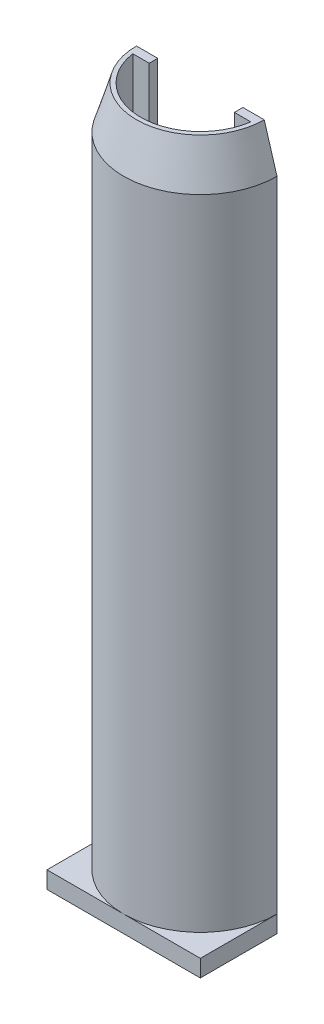
ISO-10303-21;
HEADER;
FILE_DESCRIPTION(('STEP AP214'),'2;1');
FILE_NAME('part.step','',(''),(''),'','','');
FILE_SCHEMA(('AUTOMOTIVE_DESIGN { 1 0 10303 214 1 1 1 1 }'));
ENDSEC;
DATA;
#1=APPLICATION_CONTEXT('core data for automotive mechanical design processes');
#2=APPLICATION_PROTOCOL_DEFINITION('international standard','automotive_design',2000,#1);
#3=PRODUCT_CONTEXT('',#1,'mechanical');
#4=PRODUCT('Part','Part','',(#3));
#5=PRODUCT_RELATED_PRODUCT_CATEGORY('part','',(#4));
#6=PRODUCT_DEFINITION_FORMATION('','',#4);
#7=PRODUCT_DEFINITION_CONTEXT('part definition',#1,'design');
#8=PRODUCT_DEFINITION('design','',#6,#7);
#9=PRODUCT_DEFINITION_SHAPE('','',#8);
#10=(LENGTH_UNIT() NAMED_UNIT(*) SI_UNIT(.MILLI.,.METRE.));
#11=(NAMED_UNIT(*) PLANE_ANGLE_UNIT() SI_UNIT($,.RADIAN.));
#12=(NAMED_UNIT(*) SI_UNIT($,.STERADIAN.) SOLID_ANGLE_UNIT());
#13=UNCERTAINTY_MEASURE_WITH_UNIT(LENGTH_MEASURE(1.E-05),#10,'distance_accuracy_value','');
#14=(GEOMETRIC_REPRESENTATION_CONTEXT(3) GLOBAL_UNCERTAINTY_ASSIGNED_CONTEXT((#13)) GLOBAL_UNIT_ASSIGNED_CONTEXT((#10,
#11,#12)) REPRESENTATION_CONTEXT('',''));
#15=CARTESIAN_POINT('',(0.,0.,0.));
#16=DIRECTION('',(0.,0.,1.));
#17=DIRECTION('',(1.,0.,0.));
#18=AXIS2_PLACEMENT_3D('',#15,#16,#17);
#19=CARTESIAN_POINT('',(6.01639961538458,-38.3571695384616,0.));
#20=DIRECTION('',(-1.,0.,0.));
#21=DIRECTION('',(0.,0.,1.));
#22=AXIS2_PLACEMENT_3D('',#19,#20,#21);
#23=PLANE('',#22);
#24=DIRECTION('',(0.,0.,1.));
#25=VECTOR('',#24,1.);
#26=CARTESIAN_POINT('',(6.01639961538458,-36.3571695384616,0.));
#27=LINE('',#26,#25);
#28=CARTESIAN_POINT('',(6.01639961538459,-36.3571695384616,0.));
#29=VERTEX_POINT('',#28);
#30=CARTESIAN_POINT('',(6.01639961538459,-36.3571695384616,9.));
#31=VERTEX_POINT('',#30);
#32=EDGE_CURVE('E135',#29,#31,#27,.T.);
#33=ORIENTED_EDGE('',*,*,#32,.F.);
#34=DIRECTION('',(0.,1.,0.));
#35=VECTOR('',#34,1.);
#36=CARTESIAN_POINT('',(6.01639961538459,-38.3571695384616,0.));
#37=LINE('',#36,#35);
#38=CARTESIAN_POINT('',(6.01639961538459,-38.3571695384616,0.));
#39=VERTEX_POINT('',#38);
#40=EDGE_CURVE('E13',#39,#29,#37,.T.);
#41=ORIENTED_EDGE('',*,*,#40,.F.);
#42=DIRECTION('',(0.,0.,1.));
#43=VECTOR('',#42,1.);
#44=CARTESIAN_POINT('',(6.01639961538458,-38.3571695384616,0.));
#45=LINE('',#44,#43);
#46=CARTESIAN_POINT('',(6.01639961538459,-38.3571695384616,9.));
#47=VERTEX_POINT('',#46);
#48=EDGE_CURVE('E148',#39,#47,#45,.T.);
#49=ORIENTED_EDGE('',*,*,#48,.T.);
#50=DIRECTION('',(0.,1.,0.));
#51=VECTOR('',#50,1.);
#52=CARTESIAN_POINT('',(6.01639961538459,-38.3571695384616,9.));
#53=LINE('',#52,#51);
#54=EDGE_CURVE('E100',#47,#31,#53,.T.);
#55=ORIENTED_EDGE('',*,*,#54,.T.);
#56=EDGE_LOOP('',(#33,#41,#49,#55));
#57=FACE_BOUND('',#56,.T.);
#58=ADVANCED_FACE('F55',(#57),#23,.T.);
#59=CARTESIAN_POINT('',(0.,-38.3571695384616,-1.04858958067453E-13));
#60=DIRECTION('',(0.,0.,1.));
#61=DIRECTION('',(1.,0.,0.));
#62=AXIS2_PLACEMENT_3D('',#59,#60,#61);
#63=PLANE('',#62);
#64=DIRECTION('',(1.,0.,0.));
#65=VECTOR('',#64,1.);
#66=CARTESIAN_POINT('',(0.,-36.3571695384616,-1.04858958067453E-13));
#67=LINE('',#66,#65);
#68=CARTESIAN_POINT('',(8.01639961538459,-36.3571695384616,0.));
#69=VERTEX_POINT('',#68);
#70=EDGE_CURVE('E138',#29,#69,#67,.T.);
#71=ORIENTED_EDGE('',*,*,#70,.T.);
#72=DIRECTION('',(0.,1.,0.));
#73=VECTOR('',#72,1.);
#74=CARTESIAN_POINT('',(8.01639961538459,-38.3571695384616,0.));
#75=LINE('',#74,#73);
#76=CARTESIAN_POINT('',(8.01639961538459,-38.3571695384616,0.));
#77=VERTEX_POINT('',#76);
#78=EDGE_CURVE('E63',#77,#69,#75,.T.);
#79=ORIENTED_EDGE('',*,*,#78,.F.);
#80=DIRECTION('',(1.,0.,0.));
#81=VECTOR('',#80,1.);
#82=CARTESIAN_POINT('',(0.,-38.3571695384616,-1.04858958067453E-13));
#83=LINE('',#82,#81);
#84=EDGE_CURVE('E163',#39,#77,#83,.T.);
#85=ORIENTED_EDGE('',*,*,#84,.F.);
#86=ORIENTED_EDGE('',*,*,#40,.T.);
#87=EDGE_LOOP('',(#71,#79,#85,#86));
#88=FACE_BOUND('',#87,.T.);
#89=ADVANCED_FACE('F157',(#88),#63,.F.);
#90=CARTESIAN_POINT('',(15.0163996153846,-38.3571695384616,0.));
#91=DIRECTION('',(0.,1.,0.));
#92=DIRECTION('',(-1.,0.,0.));
#93=AXIS2_PLACEMENT_3D('',#90,#91,#92);
#94=CYLINDRICAL_SURFACE('',#93,7.);
#95=CARTESIAN_POINT('',(15.0163996153846,-36.3571695384616,0.));
#96=DIRECTION('',(0.,-1.,0.));
#97=DIRECTION('',(0.,0.,-1.));
#98=AXIS2_PLACEMENT_3D('',#95,#96,#97);
#99=CIRCLE('',#98,7.);
#100=CARTESIAN_POINT('',(22.0163996153846,-36.3571695384616,0.));
#101=VERTEX_POINT('',#100);
#102=EDGE_CURVE('E141',#101,#69,#99,.T.);
#103=ORIENTED_EDGE('',*,*,#102,.F.);
#104=DIRECTION('',(0.,1.,0.));
#105=VECTOR('',#104,1.);
#106=CARTESIAN_POINT('',(22.0163996153846,-38.3571695384616,0.));
#107=LINE('',#106,#105);
#108=CARTESIAN_POINT('',(22.0163996153846,-38.3571695384616,0.));
#109=VERTEX_POINT('',#108);
#110=EDGE_CURVE('E127',#109,#101,#107,.T.);
#111=ORIENTED_EDGE('',*,*,#110,.F.);
#112=CARTESIAN_POINT('',(15.0163996153846,-38.3571695384616,0.));
#113=DIRECTION('',(0.,-1.,0.));
#114=DIRECTION('',(0.,0.,-1.));
#115=AXIS2_PLACEMENT_3D('',#112,#113,#114);
#116=CIRCLE('',#115,7.);
#117=EDGE_CURVE('E120',#109,#77,#116,.T.);
#118=ORIENTED_EDGE('',*,*,#117,.T.);
#119=ORIENTED_EDGE('',*,*,#78,.T.);
#120=EDGE_LOOP('',(#103,#111,#118,#119));
#121=FACE_BOUND('',#120,.T.);
#122=ADVANCED_FACE('F154',(#121),#94,.F.);
#123=CARTESIAN_POINT('',(0.,-38.3571695384616,0.));
#124=DIRECTION('',(0.,0.,1.));
#125=DIRECTION('',(1.,0.,0.));
#126=AXIS2_PLACEMENT_3D('',#123,#124,#125);
#127=PLANE('',#126);
#128=DIRECTION('',(1.,0.,0.));
#129=VECTOR('',#128,1.);
#130=CARTESIAN_POINT('',(0.,-36.3571695384616,0.));
#131=LINE('',#130,#129);
#132=CARTESIAN_POINT('',(24.0163996153846,-36.3571695384616,0.));
#133=VERTEX_POINT('',#132);
#134=EDGE_CURVE('E126',#101,#133,#131,.T.);
#135=ORIENTED_EDGE('',*,*,#134,.T.);
#136=DIRECTION('',(0.,1.,0.));
#137=VECTOR('',#136,1.);
#138=CARTESIAN_POINT('',(24.0163996153846,-38.3571695384616,0.));
#139=LINE('',#138,#137);
#140=CARTESIAN_POINT('',(24.0163996153846,-38.3571695384616,0.));
#141=VERTEX_POINT('',#140);
#142=EDGE_CURVE('E123',#141,#133,#139,.T.);
#143=ORIENTED_EDGE('',*,*,#142,.F.);
#144=DIRECTION('',(1.,0.,0.));
#145=VECTOR('',#144,1.);
#146=CARTESIAN_POINT('',(0.,-38.3571695384616,0.));
#147=LINE('',#146,#145);
#148=EDGE_CURVE('E114',#109,#141,#147,.T.);
#149=ORIENTED_EDGE('',*,*,#148,.F.);
#150=ORIENTED_EDGE('',*,*,#110,.T.);
#151=EDGE_LOOP('',(#135,#143,#149,#150));
#152=FACE_BOUND('',#151,.T.);
#153=ADVANCED_FACE('F124',(#152),#127,.F.);
#154=CARTESIAN_POINT('',(24.0163996153846,-38.3571695384616,0.));
#155=DIRECTION('',(-1.,0.,0.));
#156=DIRECTION('',(0.,0.,1.));
#157=AXIS2_PLACEMENT_3D('',#154,#155,#156);
#158=PLANE('',#157);
#159=DIRECTION('',(0.,0.,1.));
#160=VECTOR('',#159,1.);
#161=CARTESIAN_POINT('',(24.0163996153846,-36.3571695384616,0.));
#162=LINE('',#161,#160);
#163=CARTESIAN_POINT('',(24.0163996153846,-36.3571695384616,9.));
#164=VERTEX_POINT('',#163);
#165=EDGE_CURVE('E93',#133,#164,#162,.T.);
#166=ORIENTED_EDGE('',*,*,#165,.T.);
#167=DIRECTION('',(0.,1.,0.));
#168=VECTOR('',#167,1.);
#169=CARTESIAN_POINT('',(24.0163996153846,-38.3571695384616,9.));
#170=LINE('',#169,#168);
#171=CARTESIAN_POINT('',(24.0163996153846,-38.3571695384616,9.));
#172=VERTEX_POINT('',#171);
#173=EDGE_CURVE('E128',#172,#164,#170,.T.);
#174=ORIENTED_EDGE('',*,*,#173,.F.);
#175=DIRECTION('',(0.,0.,1.));
#176=VECTOR('',#175,1.);
#177=CARTESIAN_POINT('',(24.0163996153846,-38.3571695384616,0.));
#178=LINE('',#177,#176);
#179=EDGE_CURVE('E118',#141,#172,#178,.T.);
#180=ORIENTED_EDGE('',*,*,#179,.F.);
#181=ORIENTED_EDGE('',*,*,#142,.T.);
#182=EDGE_LOOP('',(#166,#174,#180,#181));
#183=FACE_BOUND('',#182,.T.);
#184=ADVANCED_FACE('F130',(#183),#158,.F.);
#185=CARTESIAN_POINT('',(0.,-38.3571695384616,9.));
#186=DIRECTION('',(0.,0.,-1.));
#187=DIRECTION('',(-1.,0.,0.));
#188=AXIS2_PLACEMENT_3D('',#185,#186,#187);
#189=PLANE('',#188);
#190=DIRECTION('',(-1.,0.,0.));
#191=VECTOR('',#190,1.);
#192=CARTESIAN_POINT('',(0.,-36.3571695384616,9.));
#193=LINE('',#192,#191);
#194=EDGE_CURVE('E146',#164,#31,#193,.T.);
#195=ORIENTED_EDGE('',*,*,#194,.T.);
#196=ORIENTED_EDGE('',*,*,#54,.F.);
#197=DIRECTION('',(-1.,0.,0.));
#198=VECTOR('',#197,1.);
#199=CARTESIAN_POINT('',(0.,-38.3571695384616,9.));
#200=LINE('',#199,#198);
#201=EDGE_CURVE('E71',#172,#47,#200,.T.);
#202=ORIENTED_EDGE('',*,*,#201,.F.);
#203=ORIENTED_EDGE('',*,*,#173,.T.);
#204=EDGE_LOOP('',(#195,#196,#202,#203));
#205=FACE_BOUND('',#204,.T.);
#206=ADVANCED_FACE('F162',(#205),#189,.F.);
#207=CARTESIAN_POINT('',(0.,-38.3571695384616,0.));
#208=DIRECTION('',(0.,-1.,0.));
#209=DIRECTION('',(0.,0.,-1.));
#210=AXIS2_PLACEMENT_3D('',#207,#208,#209);
#211=PLANE('',#210);
#212=ORIENTED_EDGE('',*,*,#48,.F.);
#213=ORIENTED_EDGE('',*,*,#84,.T.);
#214=ORIENTED_EDGE('',*,*,#117,.F.);
#215=ORIENTED_EDGE('',*,*,#148,.T.);
#216=ORIENTED_EDGE('',*,*,#179,.T.);
#217=ORIENTED_EDGE('',*,*,#201,.T.);
#218=EDGE_LOOP('',(#212,#213,#214,#215,#216,#217));
#219=FACE_BOUND('',#218,.T.);
#220=ADVANCED_FACE('F116',(#219),#211,.T.);
#221=CARTESIAN_POINT('',(0.,-36.3571695384616,0.));
#222=DIRECTION('',(0.,-1.,0.));
#223=DIRECTION('',(0.,0.,-1.));
#224=AXIS2_PLACEMENT_3D('',#221,#222,#223);
#225=PLANE('',#224);
#226=ORIENTED_EDGE('',*,*,#32,.T.);
#227=ORIENTED_EDGE('',*,*,#194,.F.);
#228=ORIENTED_EDGE('',*,*,#165,.F.);
#229=ORIENTED_EDGE('',*,*,#134,.F.);
#230=ORIENTED_EDGE('',*,*,#102,.T.);
#231=ORIENTED_EDGE('',*,*,#70,.F.);
#232=EDGE_LOOP('',(#226,#227,#228,#229,#230,#231));
#233=FACE_BOUND('',#232,.T.);
#234=ADVANCED_FACE('F159',(#233),#225,.F.);
#235=CLOSED_SHELL('',(#58,#89,#122,#153,#184,#206,#220,#234));
#236=MANIFOLD_SOLID_BREP('B2',#235);
#237=CARTESIAN_POINT('',(15.0163996153846,43.6428304615384,0.));
#238=DIRECTION('',(0.,1.,0.));
#239=DIRECTION('',(-1.,0.,0.));
#240=AXIS2_PLACEMENT_3D('',#237,#238,#239);
#241=CYLINDRICAL_SURFACE('',#240,7.);
#242=DIRECTION('',(0.,-1.,0.));
#243=VECTOR('',#242,1.);
#244=CARTESIAN_POINT('',(8.08819638510907,-26.3571695384616,1.));
#245=LINE('',#244,#243);
#246=CARTESIAN_POINT('',(8.08819638510907,-26.3571695384616,1.));
#247=VERTEX_POINT('',#246);
#248=CARTESIAN_POINT('',(8.08819638510907,-36.3571695384616,1.));
#249=VERTEX_POINT('',#248);
#250=EDGE_CURVE('E433',#247,#249,#245,.T.);
#251=ORIENTED_EDGE('',*,*,#250,.F.);
#252=CARTESIAN_POINT('',(15.0163996153846,-26.3571695384616,0.));
#253=DIRECTION('',(0.,-1.,0.));
#254=DIRECTION('',(0.,0.,1.));
#255=AXIS2_PLACEMENT_3D('',#252,#253,#254);
#256=CIRCLE('',#255,7.);
#257=CARTESIAN_POINT('',(8.01639961538458,-26.3571695384616,0.));
#258=VERTEX_POINT('',#257);
#259=EDGE_CURVE('E404',#258,#247,#256,.F.);
#260=ORIENTED_EDGE('',*,*,#259,.F.);
#261=DIRECTION('',(0.,-1.,0.));
#262=VECTOR('',#261,1.);
#263=CARTESIAN_POINT('',(8.01639961538458,0.,0.));
#264=LINE('',#263,#262);
#265=CARTESIAN_POINT('',(8.01639961538458,33.6428304615384,0.));
#266=VERTEX_POINT('',#265);
#267=EDGE_CURVE('E419',#266,#258,#264,.T.);
#268=ORIENTED_EDGE('',*,*,#267,.F.);
#269=CARTESIAN_POINT('',(15.0163996153846,33.6428304615384,0.));
#270=DIRECTION('',(0.,-1.,0.));
#271=DIRECTION('',(0.,0.,1.));
#272=AXIS2_PLACEMENT_3D('',#269,#270,#271);
#273=CIRCLE('',#272,7.);
#274=CARTESIAN_POINT('',(8.08819638510908,33.6428304615384,1.));
#275=VERTEX_POINT('',#274);
#276=EDGE_CURVE('E473',#266,#275,#273,.F.);
#277=ORIENTED_EDGE('',*,*,#276,.T.);
#278=DIRECTION('',(0.,1.,0.));
#279=VECTOR('',#278,1.);
#280=CARTESIAN_POINT('',(8.08819638510908,33.6428304615384,1.));
#281=LINE('',#280,#279);
#282=CARTESIAN_POINT('',(8.08819638510908,43.6428304615384,1.));
#283=VERTEX_POINT('',#282);
#284=EDGE_CURVE('E485',#275,#283,#281,.T.);
#285=ORIENTED_EDGE('',*,*,#284,.T.);
#286=CARTESIAN_POINT('',(15.0163996153846,43.6428304615384,0.));
#287=DIRECTION('',(0.,1.,0.));
#288=DIRECTION('',(-1.,0.,0.));
#289=AXIS2_PLACEMENT_3D('',#286,#287,#288);
#290=CIRCLE('',#289,7.);
#291=CARTESIAN_POINT('',(21.9446028456601,43.6428304615384,1.));
#292=VERTEX_POINT('',#291);
#293=EDGE_CURVE('E53',#283,#292,#290,.T.);
#294=ORIENTED_EDGE('',*,*,#293,.T.);
#295=DIRECTION('',(0.,1.,0.));
#296=VECTOR('',#295,1.);
#297=CARTESIAN_POINT('',(21.9446028456601,33.6428304615384,1.));
#298=LINE('',#297,#296);
#299=CARTESIAN_POINT('',(21.9446028456601,33.6428304615384,1.));
#300=VERTEX_POINT('',#299);
#301=EDGE_CURVE('E526',#300,#292,#298,.T.);
#302=ORIENTED_EDGE('',*,*,#301,.F.);
#303=CARTESIAN_POINT('',(15.0163996153846,33.6428304615384,0.));
#304=DIRECTION('',(0.,1.,0.));
#305=DIRECTION('',(0.,0.,1.));
#306=AXIS2_PLACEMENT_3D('',#303,#304,#305);
#307=CIRCLE('',#306,7.);
#308=CARTESIAN_POINT('',(22.0163996153846,33.6428304615384,0.));
#309=VERTEX_POINT('',#308);
#310=EDGE_CURVE('E515',#309,#300,#307,.F.);
#311=ORIENTED_EDGE('',*,*,#310,.F.);
#312=DIRECTION('',(0.,-1.,0.));
#313=VECTOR('',#312,1.);
#314=CARTESIAN_POINT('',(22.0163996153846,0.,0.));
#315=LINE('',#314,#313);
#316=CARTESIAN_POINT('',(22.0163996153846,-26.3571695384616,0.));
#317=VERTEX_POINT('',#316);
#318=EDGE_CURVE('E540',#309,#317,#315,.T.);
#319=ORIENTED_EDGE('',*,*,#318,.T.);
#320=CARTESIAN_POINT('',(15.0163996153846,-26.3571695384616,0.));
#321=DIRECTION('',(0.,1.,0.));
#322=DIRECTION('',(0.,0.,1.));
#323=AXIS2_PLACEMENT_3D('',#320,#321,#322);
#324=CIRCLE('',#323,7.);
#325=CARTESIAN_POINT('',(21.9446028456601,-26.3571695384616,1.));
#326=VERTEX_POINT('',#325);
#327=EDGE_CURVE('E288',#317,#326,#324,.F.);
#328=ORIENTED_EDGE('',*,*,#327,.T.);
#329=DIRECTION('',(0.,-1.,0.));
#330=VECTOR('',#329,1.);
#331=CARTESIAN_POINT('',(21.9446028456601,-26.3571695384616,1.));
#332=LINE('',#331,#330);
#333=CARTESIAN_POINT('',(21.9446028456601,-36.3571695384616,1.));
#334=VERTEX_POINT('',#333);
#335=EDGE_CURVE('E453',#326,#334,#332,.T.);
#336=ORIENTED_EDGE('',*,*,#335,.T.);
#337=CARTESIAN_POINT('',(15.0163996153846,-36.3571695384616,0.));
#338=DIRECTION('',(0.,1.,0.));
#339=DIRECTION('',(-1.,0.,0.));
#340=AXIS2_PLACEMENT_3D('',#337,#338,#339);
#341=CIRCLE('',#340,7.);
#342=EDGE_CURVE('E281',#249,#334,#341,.T.);
#343=ORIENTED_EDGE('',*,*,#342,.F.);
#344=EDGE_LOOP('',(#251,#260,#268,#277,#285,#294,#302,#311,#319,#328,#336,#343));
#345=FACE_BOUND('',#344,.T.);
#346=ADVANCED_FACE('F273',(#345),#241,.F.);
#347=CARTESIAN_POINT('',(30.0327992307692,43.6428304615384,1.04858958067453E-13));
#348=DIRECTION('',(0.,1.,0.));
#349=DIRECTION('',(-1.,0.,0.));
#350=AXIS2_PLACEMENT_3D('',#347,#348,#349);
#351=PLANE('',#350);
#352=ORIENTED_EDGE('',*,*,#293,.F.);
#353=DIRECTION('',(1.,0.,0.));
#354=VECTOR('',#353,1.);
#355=CARTESIAN_POINT('',(30.0327992307692,43.6428304615384,1.));
#356=LINE('',#355,#354);
#357=CARTESIAN_POINT('',(10.0163996153846,43.6428304615384,1.));
#358=VERTEX_POINT('',#357);
#359=EDGE_CURVE('E463',#283,#358,#356,.T.);
#360=ORIENTED_EDGE('',*,*,#359,.T.);
#361=DIRECTION('',(0.,0.,1.));
#362=VECTOR('',#361,1.);
#363=CARTESIAN_POINT('',(10.0163996153846,43.6428304615384,0.));
#364=LINE('',#363,#362);
#365=CARTESIAN_POINT('',(10.0163996153846,43.6428304615384,0.));
#366=VERTEX_POINT('',#365);
#367=EDGE_CURVE('E474',#366,#358,#364,.T.);
#368=ORIENTED_EDGE('',*,*,#367,.F.);
#369=DIRECTION('',(-1.,0.,0.));
#370=VECTOR('',#369,1.);
#371=CARTESIAN_POINT('',(30.0327992307692,43.6428304615384,1.04858958067453E-13));
#372=LINE('',#371,#370);
#373=CARTESIAN_POINT('',(7.51639961538457,43.6428304615384,0.));
#374=VERTEX_POINT('',#373);
#375=EDGE_CURVE('E555',#366,#374,#372,.T.);
#376=ORIENTED_EDGE('',*,*,#375,.T.);
#377=CARTESIAN_POINT('',(15.0163996153846,43.6428304615384,0.));
#378=DIRECTION('',(0.,1.,0.));
#379=DIRECTION('',(-1.,0.,0.));
#380=AXIS2_PLACEMENT_3D('',#377,#378,#379);
#381=CIRCLE('',#380,7.50000000000001);
#382=CARTESIAN_POINT('',(22.5163996153846,43.6428304615384,0.));
#383=VERTEX_POINT('',#382);
#384=EDGE_CURVE('E572',#374,#383,#381,.T.);
#385=ORIENTED_EDGE('',*,*,#384,.T.);
#386=DIRECTION('',(1.,0.,0.));
#387=VECTOR('',#386,1.);
#388=CARTESIAN_POINT('',(0.,43.6428304615384,0.));
#389=LINE('',#388,#387);
#390=CARTESIAN_POINT('',(20.0163996153846,43.6428304615384,0.));
#391=VERTEX_POINT('',#390);
#392=EDGE_CURVE('E530',#391,#383,#389,.T.);
#393=ORIENTED_EDGE('',*,*,#392,.F.);
#394=DIRECTION('',(0.,0.,1.));
#395=VECTOR('',#394,1.);
#396=CARTESIAN_POINT('',(20.0163996153846,43.6428304615384,0.));
#397=LINE('',#396,#395);
#398=CARTESIAN_POINT('',(20.0163996153846,43.6428304615384,1.));
#399=VERTEX_POINT('',#398);
#400=EDGE_CURVE('E496',#391,#399,#397,.T.);
#401=ORIENTED_EDGE('',*,*,#400,.T.);
#402=DIRECTION('',(-1.,0.,0.));
#403=VECTOR('',#402,1.);
#404=CARTESIAN_POINT('',(0.,43.6428304615384,1.));
#405=LINE('',#404,#403);
#406=EDGE_CURVE('E508',#292,#399,#405,.T.);
#407=ORIENTED_EDGE('',*,*,#406,.F.);
#408=EDGE_LOOP('',(#352,#360,#368,#376,#385,#393,#401,#407));
#409=FACE_BOUND('',#408,.T.);
#410=ADVANCED_FACE('F619',(#409),#351,.T.);
#411=CARTESIAN_POINT('',(30.0327992307692,-36.3571695384616,1.04858958067453E-13));
#412=DIRECTION('',(0.,1.,0.));
#413=DIRECTION('',(-1.,0.,0.));
#414=AXIS2_PLACEMENT_3D('',#411,#412,#413);
#415=PLANE('',#414);
#416=CARTESIAN_POINT('',(15.0163996153846,-36.3571695384616,0.));
#417=DIRECTION('',(0.,1.,0.));
#418=DIRECTION('',(-1.,0.,0.));
#419=AXIS2_PLACEMENT_3D('',#416,#417,#418);
#420=CIRCLE('',#419,9.);
#421=CARTESIAN_POINT('',(6.01639961538459,-36.3571695384616,0.));
#422=VERTEX_POINT('',#421);
#423=CARTESIAN_POINT('',(24.0163996153846,-36.3571695384616,0.));
#424=VERTEX_POINT('',#423);
#425=EDGE_CURVE('E578',#422,#424,#420,.T.);
#426=ORIENTED_EDGE('',*,*,#425,.F.);
#427=DIRECTION('',(-1.,0.,0.));
#428=VECTOR('',#427,1.);
#429=CARTESIAN_POINT('',(30.0327992307692,-36.3571695384616,1.04858958067453E-13));
#430=LINE('',#429,#428);
#431=CARTESIAN_POINT('',(10.0163996153846,-36.3571695384616,0.));
#432=VERTEX_POINT('',#431);
#433=EDGE_CURVE('E561',#432,#422,#430,.T.);
#434=ORIENTED_EDGE('',*,*,#433,.F.);
#435=DIRECTION('',(0.,0.,1.));
#436=VECTOR('',#435,1.);
#437=CARTESIAN_POINT('',(10.0163996153846,-36.3571695384616,0.));
#438=LINE('',#437,#436);
#439=CARTESIAN_POINT('',(10.0163996153846,-36.3571695384616,1.));
#440=VERTEX_POINT('',#439);
#441=EDGE_CURVE('E398',#432,#440,#438,.T.);
#442=ORIENTED_EDGE('',*,*,#441,.T.);
#443=DIRECTION('',(1.,0.,0.));
#444=VECTOR('',#443,1.);
#445=CARTESIAN_POINT('',(30.0327992307692,-36.3571695384616,1.));
#446=LINE('',#445,#444);
#447=EDGE_CURVE('E421',#249,#440,#446,.T.);
#448=ORIENTED_EDGE('',*,*,#447,.F.);
#449=ORIENTED_EDGE('',*,*,#342,.T.);
#450=DIRECTION('',(-1.,0.,0.));
#451=VECTOR('',#450,1.);
#452=CARTESIAN_POINT('',(0.,-36.3571695384616,1.));
#453=LINE('',#452,#451);
#454=CARTESIAN_POINT('',(20.0163996153846,-36.3571695384616,1.));
#455=VERTEX_POINT('',#454);
#456=EDGE_CURVE('E436',#334,#455,#453,.T.);
#457=ORIENTED_EDGE('',*,*,#456,.T.);
#458=DIRECTION('',(0.,0.,1.));
#459=VECTOR('',#458,1.);
#460=CARTESIAN_POINT('',(20.0163996153846,-36.3571695384616,0.));
#461=LINE('',#460,#459);
#462=CARTESIAN_POINT('',(20.0163996153846,-36.3571695384616,0.));
#463=VERTEX_POINT('',#462);
#464=EDGE_CURVE('E443',#463,#455,#461,.T.);
#465=ORIENTED_EDGE('',*,*,#464,.F.);
#466=DIRECTION('',(1.,0.,0.));
#467=VECTOR('',#466,1.);
#468=CARTESIAN_POINT('',(0.,-36.3571695384616,0.));
#469=LINE('',#468,#467);
#470=EDGE_CURVE('E543',#463,#424,#469,.T.);
#471=ORIENTED_EDGE('',*,*,#470,.T.);
#472=EDGE_LOOP('',(#426,#434,#442,#448,#449,#457,#465,#471));
#473=FACE_BOUND('',#472,.T.);
#474=ADVANCED_FACE('F586',(#473),#415,.F.);
#475=CARTESIAN_POINT('',(15.0163996153846,43.6428304615384,0.));
#476=DIRECTION('',(0.,1.,0.));
#477=DIRECTION('',(-1.,0.,0.));
#478=AXIS2_PLACEMENT_3D('',#475,#476,#477);
#479=CYLINDRICAL_SURFACE('',#478,9.00000000000001);
#480=CARTESIAN_POINT('',(15.0163996153846,38.6428304615384,0.));
#481=DIRECTION('',(0.,1.,0.));
#482=DIRECTION('',(-1.,0.,0.));
#483=AXIS2_PLACEMENT_3D('',#480,#481,#482);
#484=CIRCLE('',#483,9.00000000000001);
#485=CARTESIAN_POINT('',(6.01639961538457,38.6428304615384,0.));
#486=VERTEX_POINT('',#485);
#487=CARTESIAN_POINT('',(24.0163996153846,38.6428304615384,0.));
#488=VERTEX_POINT('',#487);
#489=EDGE_CURVE('E575',#486,#488,#484,.T.);
#490=ORIENTED_EDGE('',*,*,#489,.F.);
#491=DIRECTION('',(0.,-1.,0.));
#492=VECTOR('',#491,1.);
#493=CARTESIAN_POINT('',(6.01639961538458,0.,0.));
#494=LINE('',#493,#492);
#495=EDGE_CURVE('E564',#486,#422,#494,.T.);
#496=ORIENTED_EDGE('',*,*,#495,.T.);
#497=ORIENTED_EDGE('',*,*,#425,.T.);
#498=DIRECTION('',(0.,-1.,0.));
#499=VECTOR('',#498,1.);
#500=CARTESIAN_POINT('',(24.0163996153846,0.,0.));
#501=LINE('',#500,#499);
#502=EDGE_CURVE('E547',#488,#424,#501,.T.);
#503=ORIENTED_EDGE('',*,*,#502,.F.);
#504=EDGE_LOOP('',(#490,#496,#497,#503));
#505=FACE_BOUND('',#504,.T.);
#506=ADVANCED_FACE('F583',(#505),#479,.T.);
#507=CARTESIAN_POINT('',(15.0163996153846,43.6428304615384,0.));
#508=DIRECTION('',(0.,-1.,0.));
#509=DIRECTION('',(1.,0.,0.));
#510=AXIS2_PLACEMENT_3D('',#507,#508,#509);
#511=CONICAL_SURFACE('',#510,7.50000000000001,0.291456794477867);
#512=DIRECTION('',(-0.287347885566346,-0.957826285221152,0.));
#513=VECTOR('',#512,1.);
#514=CARTESIAN_POINT('',(-2.63623632321809,9.80071066619618,-1.23267697922046E-13));
#515=LINE('',#514,#513);
#516=EDGE_CURVE('E568',#374,#486,#515,.T.);
#517=ORIENTED_EDGE('',*,*,#516,.T.);
#518=ORIENTED_EDGE('',*,*,#489,.T.);
#519=DIRECTION('',(0.287347885566346,-0.957826285221151,0.));
#520=VECTOR('',#519,1.);
#521=CARTESIAN_POINT('',(32.6690355539872,9.80071066619619,0.));
#522=LINE('',#521,#520);
#523=EDGE_CURVE('E551',#383,#488,#522,.T.);
#524=ORIENTED_EDGE('',*,*,#523,.F.);
#525=ORIENTED_EDGE('',*,*,#384,.F.);
#526=EDGE_LOOP('',(#517,#518,#524,#525));
#527=FACE_BOUND('',#526,.T.);
#528=ADVANCED_FACE('F592',(#527),#511,.T.);
#529=CARTESIAN_POINT('',(30.0327992307692,0.,1.04858958067453E-13));
#530=DIRECTION('',(0.,0.,-1.));
#531=DIRECTION('',(-1.,0.,0.));
#532=AXIS2_PLACEMENT_3D('',#529,#530,#531);
#533=PLANE('',#532);
#534=ORIENTED_EDGE('',*,*,#375,.F.);
#535=DIRECTION('',(0.,1.,0.));
#536=VECTOR('',#535,1.);
#537=CARTESIAN_POINT('',(10.0163996153846,33.6428304615384,0.));
#538=LINE('',#537,#536);
#539=CARTESIAN_POINT('',(10.0163996153846,33.6428304615384,0.));
#540=VERTEX_POINT('',#539);
#541=EDGE_CURVE('E492',#540,#366,#538,.T.);
#542=ORIENTED_EDGE('',*,*,#541,.F.);
#543=DIRECTION('',(1.,0.,0.));
#544=VECTOR('',#543,1.);
#545=CARTESIAN_POINT('',(30.0327992307692,33.6428304615384,0.));
#546=LINE('',#545,#544);
#547=EDGE_CURVE('E469',#266,#540,#546,.T.);
#548=ORIENTED_EDGE('',*,*,#547,.F.);
#549=ORIENTED_EDGE('',*,*,#267,.T.);
#550=DIRECTION('',(1.,0.,0.));
#551=VECTOR('',#550,1.);
#552=CARTESIAN_POINT('',(30.0327992307692,-26.3571695384616,0.));
#553=LINE('',#552,#551);
#554=CARTESIAN_POINT('',(10.0163996153846,-26.3571695384616,0.));
#555=VERTEX_POINT('',#554);
#556=EDGE_CURVE('E408',#258,#555,#553,.T.);
#557=ORIENTED_EDGE('',*,*,#556,.T.);
#558=DIRECTION('',(0.,-1.,0.));
#559=VECTOR('',#558,1.);
#560=CARTESIAN_POINT('',(10.0163996153846,-26.3571695384616,0.));
#561=LINE('',#560,#559);
#562=EDGE_CURVE('E393',#555,#432,#561,.T.);
#563=ORIENTED_EDGE('',*,*,#562,.T.);
#564=ORIENTED_EDGE('',*,*,#433,.T.);
#565=ORIENTED_EDGE('',*,*,#495,.F.);
#566=ORIENTED_EDGE('',*,*,#516,.F.);
#567=EDGE_LOOP('',(#534,#542,#548,#549,#557,#563,#564,#565,#566));
#568=FACE_BOUND('',#567,.T.);
#569=ADVANCED_FACE('F416',(#568),#533,.T.);
#570=CARTESIAN_POINT('',(0.,0.,0.));
#571=DIRECTION('',(0.,0.,1.));
#572=DIRECTION('',(1.,0.,0.));
#573=AXIS2_PLACEMENT_3D('',#570,#571,#572);
#574=PLANE('',#573);
#575=ORIENTED_EDGE('',*,*,#392,.T.);
#576=ORIENTED_EDGE('',*,*,#523,.T.);
#577=ORIENTED_EDGE('',*,*,#502,.T.);
#578=ORIENTED_EDGE('',*,*,#470,.F.);
#579=DIRECTION('',(0.,-1.,0.));
#580=VECTOR('',#579,1.);
#581=CARTESIAN_POINT('',(20.0163996153846,-26.3571695384616,0.));
#582=LINE('',#581,#580);
#583=CARTESIAN_POINT('',(20.0163996153846,-26.3571695384616,0.));
#584=VERTEX_POINT('',#583);
#585=EDGE_CURVE('E459',#584,#463,#582,.T.);
#586=ORIENTED_EDGE('',*,*,#585,.F.);
#587=DIRECTION('',(-1.,0.,0.));
#588=VECTOR('',#587,1.);
#589=CARTESIAN_POINT('',(0.,-26.3571695384616,0.));
#590=LINE('',#589,#588);
#591=EDGE_CURVE('E439',#317,#584,#590,.T.);
#592=ORIENTED_EDGE('',*,*,#591,.F.);
#593=ORIENTED_EDGE('',*,*,#318,.F.);
#594=DIRECTION('',(-1.,0.,0.));
#595=VECTOR('',#594,1.);
#596=CARTESIAN_POINT('',(0.,33.6428304615384,0.));
#597=LINE('',#596,#595);
#598=CARTESIAN_POINT('',(20.0163996153846,33.6428304615384,0.));
#599=VERTEX_POINT('',#598);
#600=EDGE_CURVE('E503',#309,#599,#597,.T.);
#601=ORIENTED_EDGE('',*,*,#600,.T.);
#602=DIRECTION('',(0.,1.,0.));
#603=VECTOR('',#602,1.);
#604=CARTESIAN_POINT('',(20.0163996153846,33.6428304615384,0.));
#605=LINE('',#604,#603);
#606=EDGE_CURVE('E519',#599,#391,#605,.T.);
#607=ORIENTED_EDGE('',*,*,#606,.T.);
#608=EDGE_LOOP('',(#575,#576,#577,#578,#586,#592,#593,#601,#607));
#609=FACE_BOUND('',#608,.T.);
#610=ADVANCED_FACE('F589',(#609),#574,.F.);
#611=CARTESIAN_POINT('',(0.,33.6428304615384,1.));
#612=DIRECTION('',(0.,0.,-1.));
#613=DIRECTION('',(-1.,0.,0.));
#614=AXIS2_PLACEMENT_3D('',#611,#612,#613);
#615=PLANE('',#614);
#616=ORIENTED_EDGE('',*,*,#406,.T.);
#617=DIRECTION('',(0.,1.,0.));
#618=VECTOR('',#617,1.);
#619=CARTESIAN_POINT('',(20.0163996153846,33.6428304615384,1.));
#620=LINE('',#619,#618);
#621=CARTESIAN_POINT('',(20.0163996153846,33.6428304615384,1.));
#622=VERTEX_POINT('',#621);
#623=EDGE_CURVE('E531',#622,#399,#620,.T.);
#624=ORIENTED_EDGE('',*,*,#623,.F.);
#625=DIRECTION('',(-1.,0.,0.));
#626=VECTOR('',#625,1.);
#627=CARTESIAN_POINT('',(0.,33.6428304615384,1.));
#628=LINE('',#627,#626);
#629=EDGE_CURVE('E512',#300,#622,#628,.T.);
#630=ORIENTED_EDGE('',*,*,#629,.F.);
#631=ORIENTED_EDGE('',*,*,#301,.T.);
#632=EDGE_LOOP('',(#616,#624,#630,#631));
#633=FACE_BOUND('',#632,.T.);
#634=ADVANCED_FACE('F655',(#633),#615,.F.);
#635=CARTESIAN_POINT('',(20.0163996153846,33.6428304615384,0.));
#636=DIRECTION('',(-1.,0.,0.));
#637=DIRECTION('',(0.,0.,1.));
#638=AXIS2_PLACEMENT_3D('',#635,#636,#637);
#639=PLANE('',#638);
#640=ORIENTED_EDGE('',*,*,#400,.F.);
#641=ORIENTED_EDGE('',*,*,#606,.F.);
#642=DIRECTION('',(0.,0.,1.));
#643=VECTOR('',#642,1.);
#644=CARTESIAN_POINT('',(20.0163996153846,33.6428304615384,0.));
#645=LINE('',#644,#643);
#646=EDGE_CURVE('E507',#599,#622,#645,.T.);
#647=ORIENTED_EDGE('',*,*,#646,.T.);
#648=ORIENTED_EDGE('',*,*,#623,.T.);
#649=EDGE_LOOP('',(#640,#641,#647,#648));
#650=FACE_BOUND('',#649,.T.);
#651=ADVANCED_FACE('F661',(#650),#639,.T.);
#652=CARTESIAN_POINT('',(0.,33.6428304615384,0.));
#653=DIRECTION('',(0.,1.,0.));
#654=DIRECTION('',(0.,0.,1.));
#655=AXIS2_PLACEMENT_3D('',#652,#653,#654);
#656=PLANE('',#655);
#657=ORIENTED_EDGE('',*,*,#600,.F.);
#658=ORIENTED_EDGE('',*,*,#310,.T.);
#659=ORIENTED_EDGE('',*,*,#629,.T.);
#660=ORIENTED_EDGE('',*,*,#646,.F.);
#661=EDGE_LOOP('',(#657,#658,#659,#660));
#662=FACE_BOUND('',#661,.T.);
#663=ADVANCED_FACE('F669',(#662),#656,.F.);
#664=CARTESIAN_POINT('',(10.0163996153846,33.6428304615384,0.));
#665=DIRECTION('',(-1.,0.,0.));
#666=DIRECTION('',(0.,0.,1.));
#667=AXIS2_PLACEMENT_3D('',#664,#665,#666);
#668=PLANE('',#667);
#669=ORIENTED_EDGE('',*,*,#367,.T.);
#670=DIRECTION('',(0.,1.,0.));
#671=VECTOR('',#670,1.);
#672=CARTESIAN_POINT('',(10.0163996153846,33.6428304615384,1.));
#673=LINE('',#672,#671);
#674=CARTESIAN_POINT('',(10.0163996153846,33.6428304615384,1.));
#675=VERTEX_POINT('',#674);
#676=EDGE_CURVE('E497',#675,#358,#673,.T.);
#677=ORIENTED_EDGE('',*,*,#676,.F.);
#678=DIRECTION('',(0.,0.,1.));
#679=VECTOR('',#678,1.);
#680=CARTESIAN_POINT('',(10.0163996153846,33.6428304615384,0.));
#681=LINE('',#680,#679);
#682=EDGE_CURVE('E482',#540,#675,#681,.T.);
#683=ORIENTED_EDGE('',*,*,#682,.F.);
#684=ORIENTED_EDGE('',*,*,#541,.T.);
#685=EDGE_LOOP('',(#669,#677,#683,#684));
#686=FACE_BOUND('',#685,.T.);
#687=ADVANCED_FACE('F677',(#686),#668,.F.);
#688=CARTESIAN_POINT('',(30.0327992307692,33.6428304615384,1.));
#689=DIRECTION('',(0.,0.,1.));
#690=DIRECTION('',(1.,0.,0.));
#691=AXIS2_PLACEMENT_3D('',#688,#689,#690);
#692=PLANE('',#691);
#693=ORIENTED_EDGE('',*,*,#359,.F.);
#694=ORIENTED_EDGE('',*,*,#284,.F.);
#695=DIRECTION('',(1.,0.,0.));
#696=VECTOR('',#695,1.);
#697=CARTESIAN_POINT('',(30.0327992307692,33.6428304615384,1.));
#698=LINE('',#697,#696);
#699=EDGE_CURVE('E478',#275,#675,#698,.T.);
#700=ORIENTED_EDGE('',*,*,#699,.T.);
#701=ORIENTED_EDGE('',*,*,#676,.T.);
#702=EDGE_LOOP('',(#693,#694,#700,#701));
#703=FACE_BOUND('',#702,.T.);
#704=ADVANCED_FACE('F684',(#703),#692,.T.);
#705=CARTESIAN_POINT('',(30.0327992307692,33.6428304615384,0.));
#706=DIRECTION('',(0.,1.,0.));
#707=DIRECTION('',(0.,0.,1.));
#708=AXIS2_PLACEMENT_3D('',#705,#706,#707);
#709=PLANE('',#708);
#710=ORIENTED_EDGE('',*,*,#547,.T.);
#711=ORIENTED_EDGE('',*,*,#682,.T.);
#712=ORIENTED_EDGE('',*,*,#699,.F.);
#713=ORIENTED_EDGE('',*,*,#276,.F.);
#714=EDGE_LOOP('',(#710,#711,#712,#713));
#715=FACE_BOUND('',#714,.T.);
#716=ADVANCED_FACE('F692',(#715),#709,.F.);
#717=CARTESIAN_POINT('',(20.0163996153846,-26.3571695384616,0.));
#718=DIRECTION('',(1.,0.,0.));
#719=DIRECTION('',(0.,0.,-1.));
#720=AXIS2_PLACEMENT_3D('',#717,#718,#719);
#721=PLANE('',#720);
#722=ORIENTED_EDGE('',*,*,#464,.T.);
#723=DIRECTION('',(0.,-1.,0.));
#724=VECTOR('',#723,1.);
#725=CARTESIAN_POINT('',(20.0163996153846,-26.3571695384616,1.));
#726=LINE('',#725,#724);
#727=CARTESIAN_POINT('',(20.0163996153846,-26.3571695384616,1.));
#728=VERTEX_POINT('',#727);
#729=EDGE_CURVE('E464',#728,#455,#726,.T.);
#730=ORIENTED_EDGE('',*,*,#729,.F.);
#731=DIRECTION('',(0.,0.,1.));
#732=VECTOR('',#731,1.);
#733=CARTESIAN_POINT('',(20.0163996153846,-26.3571695384616,0.));
#734=LINE('',#733,#732);
#735=EDGE_CURVE('E450',#584,#728,#734,.T.);
#736=ORIENTED_EDGE('',*,*,#735,.F.);
#737=ORIENTED_EDGE('',*,*,#585,.T.);
#738=EDGE_LOOP('',(#722,#730,#736,#737));
#739=FACE_BOUND('',#738,.T.);
#740=ADVANCED_FACE('F602',(#739),#721,.F.);
#741=CARTESIAN_POINT('',(0.,-26.3571695384616,1.));
#742=DIRECTION('',(0.,0.,1.));
#743=DIRECTION('',(1.,0.,0.));
#744=AXIS2_PLACEMENT_3D('',#741,#742,#743);
#745=PLANE('',#744);
#746=ORIENTED_EDGE('',*,*,#456,.F.);
#747=ORIENTED_EDGE('',*,*,#335,.F.);
#748=DIRECTION('',(-1.,0.,0.));
#749=VECTOR('',#748,1.);
#750=CARTESIAN_POINT('',(0.,-26.3571695384616,1.));
#751=LINE('',#750,#749);
#752=EDGE_CURVE('E446',#326,#728,#751,.T.);
#753=ORIENTED_EDGE('',*,*,#752,.T.);
#754=ORIENTED_EDGE('',*,*,#729,.T.);
#755=EDGE_LOOP('',(#746,#747,#753,#754));
#756=FACE_BOUND('',#755,.T.);
#757=ADVANCED_FACE('F599',(#756),#745,.T.);
#758=CARTESIAN_POINT('',(0.,-26.3571695384616,0.));
#759=DIRECTION('',(0.,-1.,0.));
#760=DIRECTION('',(0.,0.,1.));
#761=AXIS2_PLACEMENT_3D('',#758,#759,#760);
#762=PLANE('',#761);
#763=ORIENTED_EDGE('',*,*,#591,.T.);
#764=ORIENTED_EDGE('',*,*,#735,.T.);
#765=ORIENTED_EDGE('',*,*,#752,.F.);
#766=ORIENTED_EDGE('',*,*,#327,.F.);
#767=EDGE_LOOP('',(#763,#764,#765,#766));
#768=FACE_BOUND('',#767,.T.);
#769=ADVANCED_FACE('F606',(#768),#762,.F.);
#770=CARTESIAN_POINT('',(30.0327992307692,-26.3571695384616,1.));
#771=DIRECTION('',(0.,0.,-1.));
#772=DIRECTION('',(-1.,0.,0.));
#773=AXIS2_PLACEMENT_3D('',#770,#771,#772);
#774=PLANE('',#773);
#775=ORIENTED_EDGE('',*,*,#447,.T.);
#776=DIRECTION('',(0.,-1.,0.));
#777=VECTOR('',#776,1.);
#778=CARTESIAN_POINT('',(10.0163996153846,-26.3571695384616,1.));
#779=LINE('',#778,#777);
#780=CARTESIAN_POINT('',(10.0163996153846,-26.3571695384616,1.));
#781=VERTEX_POINT('',#780);
#782=EDGE_CURVE('E403',#781,#440,#779,.T.);
#783=ORIENTED_EDGE('',*,*,#782,.F.);
#784=DIRECTION('',(1.,0.,0.));
#785=VECTOR('',#784,1.);
#786=CARTESIAN_POINT('',(30.0327992307692,-26.3571695384616,1.));
#787=LINE('',#786,#785);
#788=EDGE_CURVE('E411',#247,#781,#787,.T.);
#789=ORIENTED_EDGE('',*,*,#788,.F.);
#790=ORIENTED_EDGE('',*,*,#250,.T.);
#791=EDGE_LOOP('',(#775,#783,#789,#790));
#792=FACE_BOUND('',#791,.T.);
#793=ADVANCED_FACE('F608',(#792),#774,.F.);
#794=CARTESIAN_POINT('',(10.0163996153846,-26.3571695384616,0.));
#795=DIRECTION('',(1.,0.,0.));
#796=DIRECTION('',(0.,0.,-1.));
#797=AXIS2_PLACEMENT_3D('',#794,#795,#796);
#798=PLANE('',#797);
#799=ORIENTED_EDGE('',*,*,#441,.F.);
#800=ORIENTED_EDGE('',*,*,#562,.F.);
#801=DIRECTION('',(0.,0.,1.));
#802=VECTOR('',#801,1.);
#803=CARTESIAN_POINT('',(10.0163996153846,-26.3571695384616,0.));
#804=LINE('',#803,#802);
#805=EDGE_CURVE('E396',#555,#781,#804,.T.);
#806=ORIENTED_EDGE('',*,*,#805,.T.);
#807=ORIENTED_EDGE('',*,*,#782,.T.);
#808=EDGE_LOOP('',(#799,#800,#806,#807));
#809=FACE_BOUND('',#808,.T.);
#810=ADVANCED_FACE('F395',(#809),#798,.T.);
#811=CARTESIAN_POINT('',(30.0327992307692,-26.3571695384616,0.));
#812=DIRECTION('',(0.,-1.,0.));
#813=DIRECTION('',(0.,0.,1.));
#814=AXIS2_PLACEMENT_3D('',#811,#812,#813);
#815=PLANE('',#814);
#816=ORIENTED_EDGE('',*,*,#556,.F.);
#817=ORIENTED_EDGE('',*,*,#259,.T.);
#818=ORIENTED_EDGE('',*,*,#788,.T.);
#819=ORIENTED_EDGE('',*,*,#805,.F.);
#820=EDGE_LOOP('',(#816,#817,#818,#819));
#821=FACE_BOUND('',#820,.T.);
#822=ADVANCED_FACE('F407',(#821),#815,.F.);
#823=CLOSED_SHELL('',(#346,#410,#474,#506,#528,#569,#610,#634,#651,#663,#687,#704,#716,#740,
#757,#769,#793,#810,#822));
#824=MANIFOLD_SOLID_BREP('B7',#823);
#825=ADVANCED_BREP_SHAPE_REPRESENTATION('',(#18,#236,#824),#14);
#826=SHAPE_DEFINITION_REPRESENTATION(#9,#825);
ENDSEC;
END-ISO-10303-21;
